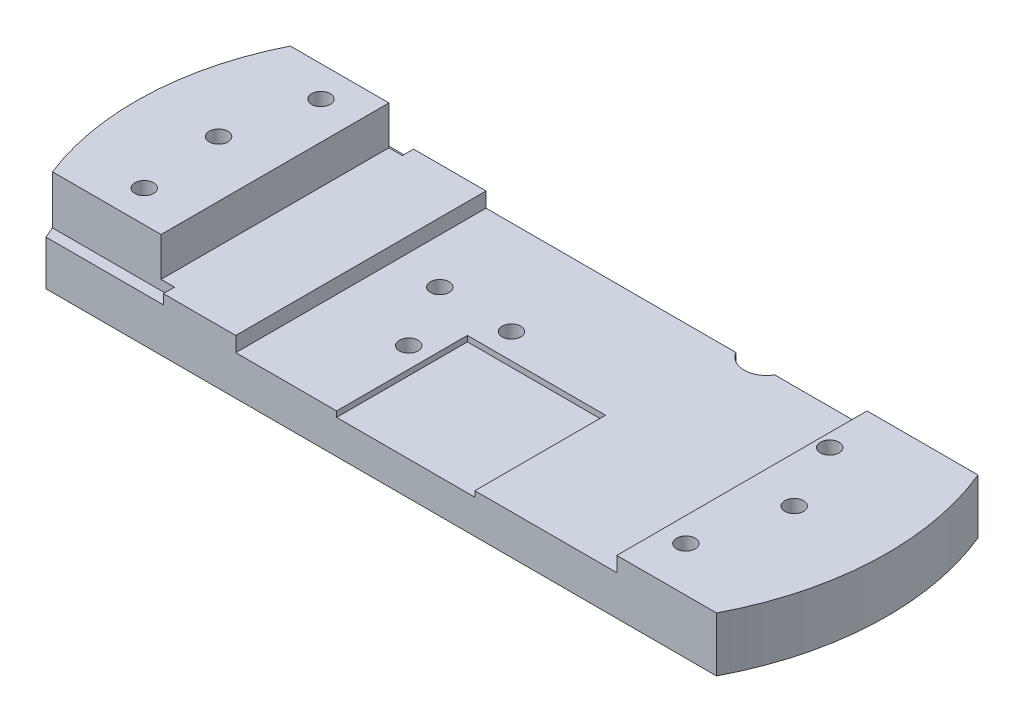
ISO-10303-21;
HEADER;
FILE_DESCRIPTION(('STEP AP214'),'2;1');
FILE_NAME('part.step','',(''),(''),'','','');
FILE_SCHEMA(('AUTOMOTIVE_DESIGN { 1 0 10303 214 1 1 1 1 }'));
ENDSEC;
DATA;
#1=APPLICATION_CONTEXT('core data for automotive mechanical design processes');
#2=APPLICATION_PROTOCOL_DEFINITION('international standard','automotive_design',2000,#1);
#3=PRODUCT_CONTEXT('',#1,'mechanical');
#4=PRODUCT('Part','Part','',(#3));
#5=PRODUCT_RELATED_PRODUCT_CATEGORY('part','',(#4));
#6=PRODUCT_DEFINITION_FORMATION('','',#4);
#7=PRODUCT_DEFINITION_CONTEXT('part definition',#1,'design');
#8=PRODUCT_DEFINITION('design','',#6,#7);
#9=PRODUCT_DEFINITION_SHAPE('','',#8);
#10=(LENGTH_UNIT() NAMED_UNIT(*) SI_UNIT(.MILLI.,.METRE.));
#11=(NAMED_UNIT(*) PLANE_ANGLE_UNIT() SI_UNIT($,.RADIAN.));
#12=(NAMED_UNIT(*) SI_UNIT($,.STERADIAN.) SOLID_ANGLE_UNIT());
#13=UNCERTAINTY_MEASURE_WITH_UNIT(LENGTH_MEASURE(1.E-05),#10,'distance_accuracy_value','');
#14=(GEOMETRIC_REPRESENTATION_CONTEXT(3) GLOBAL_UNCERTAINTY_ASSIGNED_CONTEXT((#13)) GLOBAL_UNIT_ASSIGNED_CONTEXT((#10,
#11,#12)) REPRESENTATION_CONTEXT('',''));
#15=CARTESIAN_POINT('',(0.,0.,0.));
#16=DIRECTION('',(0.,0.,1.));
#17=DIRECTION('',(1.,0.,0.));
#18=AXIS2_PLACEMENT_3D('',#15,#16,#17);
#19=CARTESIAN_POINT('',(0.,25.,0.));
#20=DIRECTION('',(0.,-1.,0.));
#21=DIRECTION('',(0.,0.,-1.));
#22=AXIS2_PLACEMENT_3D('',#19,#20,#21);
#23=PLANE('',#22);
#24=CARTESIAN_POINT('',(-76.2,25.,22.));
#25=DIRECTION('',(0.,-1.,0.));
#26=DIRECTION('',(0.,0.,-1.));
#27=AXIS2_PLACEMENT_3D('',#24,#25,#26);
#28=CIRCLE('',#27,2.50000000000001);
#29=CARTESIAN_POINT('',(-76.2,25.,19.5));
#30=VERTEX_POINT('',#29);
#31=EDGE_CURVE('E326',#30,#30,#28,.T.);
#32=ORIENTED_EDGE('',*,*,#31,.T.);
#33=EDGE_LOOP('',(#32));
#34=FACE_BOUND('',#33,.T.);
#35=CARTESIAN_POINT('',(-78.2,25.,0.100000000000003));
#36=DIRECTION('',(0.,-1.,0.));
#37=DIRECTION('',(0.,0.,-1.));
#38=AXIS2_PLACEMENT_3D('',#35,#36,#37);
#39=CIRCLE('',#38,2.49999999999999);
#40=CARTESIAN_POINT('',(-78.2,25.,-2.39999999999999));
#41=VERTEX_POINT('',#40);
#42=EDGE_CURVE('E334',#41,#41,#39,.T.);
#43=ORIENTED_EDGE('',*,*,#42,.T.);
#44=EDGE_LOOP('',(#43));
#45=FACE_BOUND('',#44,.T.);
#46=CARTESIAN_POINT('',(-73.2,25.,-22.3));
#47=DIRECTION('',(0.,-1.,0.));
#48=DIRECTION('',(0.,0.,-1.));
#49=AXIS2_PLACEMENT_3D('',#46,#47,#48);
#50=CIRCLE('',#49,2.50000000000001);
#51=CARTESIAN_POINT('',(-73.2,25.,-24.8));
#52=VERTEX_POINT('',#51);
#53=EDGE_CURVE('E297',#52,#52,#50,.T.);
#54=ORIENTED_EDGE('',*,*,#53,.T.);
#55=EDGE_LOOP('',(#54));
#56=FACE_BOUND('',#55,.T.);
#57=DIRECTION('',(-1.,0.,0.));
#58=VECTOR('',#57,1.);
#59=CARTESIAN_POINT('',(0.,25.,-30.5));
#60=LINE('',#59,#58);
#61=CARTESIAN_POINT('',(-63.2,25.,-30.5));
#62=VERTEX_POINT('',#61);
#63=CARTESIAN_POINT('',(-89.5873446539231,25.,-30.5));
#64=VERTEX_POINT('',#63);
#65=EDGE_CURVE('E349',#62,#64,#60,.T.);
#66=ORIENTED_EDGE('',*,*,#65,.T.);
#67=CARTESIAN_POINT('',(-22.6589151875398,25.,2.99288439458776));
#68=DIRECTION('',(0.,-1.,0.));
#69=DIRECTION('',(0.,0.,-1.));
#70=AXIS2_PLACEMENT_3D('',#67,#68,#69);
#71=CIRCLE('',#70,74.8410848124602);
#72=CARTESIAN_POINT('',(-92.2616921937509,25.,30.5));
#73=VERTEX_POINT('',#72);
#74=EDGE_CURVE('E483',#73,#64,#71,.T.);
#75=ORIENTED_EDGE('',*,*,#74,.F.);
#76=DIRECTION('',(-1.,0.,0.));
#77=VECTOR('',#76,1.);
#78=CARTESIAN_POINT('',(0.,25.,30.5));
#79=LINE('',#78,#77);
#80=CARTESIAN_POINT('',(-63.2,25.,30.5));
#81=VERTEX_POINT('',#80);
#82=EDGE_CURVE('E379',#81,#73,#79,.T.);
#83=ORIENTED_EDGE('',*,*,#82,.F.);
#84=DIRECTION('',(0.,0.,1.));
#85=VECTOR('',#84,1.);
#86=CARTESIAN_POINT('',(-63.2,25.,-33.5));
#87=LINE('',#86,#85);
#88=EDGE_CURVE('E462',#62,#81,#87,.T.);
#89=ORIENTED_EDGE('',*,*,#88,.F.);
#90=EDGE_LOOP('',(#66,#75,#83,#89));
#91=FACE_BOUND('',#90,.T.);
#92=ADVANCED_FACE('F87',(#34,#45,#56,#91),#23,.F.);
#93=CARTESIAN_POINT('',(-97.5,25.,-33.5));
#94=DIRECTION('',(0.,0.,1.));
#95=DIRECTION('',(1.,0.,0.));
#96=AXIS2_PLACEMENT_3D('',#93,#94,#95);
#97=PLANE('',#96);
#98=DIRECTION('',(1.,0.,0.));
#99=VECTOR('',#98,1.);
#100=CARTESIAN_POINT('',(0.,6.5,-33.5));
#101=LINE('',#100,#99);
#102=CARTESIAN_POINT('',(26.7038475772934,6.5,-33.5));
#103=VERTEX_POINT('',#102);
#104=CARTESIAN_POINT('',(37.0961524227066,6.5,-33.5));
#105=VERTEX_POINT('',#104);
#106=EDGE_CURVE('E238',#103,#105,#101,.T.);
#107=ORIENTED_EDGE('',*,*,#106,.T.);
#108=DIRECTION('',(0.,1.,0.));
#109=VECTOR('',#108,1.);
#110=CARTESIAN_POINT('',(37.0961524227066,6.5,-33.5));
#111=LINE('',#110,#109);
#112=CARTESIAN_POINT('',(37.0961524227066,10.6,-33.5));
#113=VERTEX_POINT('',#112);
#114=EDGE_CURVE('E246',#105,#113,#111,.T.);
#115=ORIENTED_EDGE('',*,*,#114,.T.);
#116=DIRECTION('',(1.,0.,0.));
#117=VECTOR('',#116,1.);
#118=CARTESIAN_POINT('',(0.,10.6,-33.5));
#119=LINE('',#118,#117);
#120=CARTESIAN_POINT('',(61.8,10.6,-33.5));
#121=VERTEX_POINT('',#120);
#122=EDGE_CURVE('E425',#113,#121,#119,.T.);
#123=ORIENTED_EDGE('',*,*,#122,.T.);
#124=DIRECTION('',(0.,1.,0.));
#125=VECTOR('',#124,1.);
#126=CARTESIAN_POINT('',(61.8,0.,-33.5));
#127=LINE('',#126,#125);
#128=CARTESIAN_POINT('',(61.8,14.5999999999999,-33.5));
#129=VERTEX_POINT('',#128);
#130=EDGE_CURVE('E410',#121,#129,#127,.T.);
#131=ORIENTED_EDGE('',*,*,#130,.T.);
#132=DIRECTION('',(1.,0.,0.));
#133=VECTOR('',#132,1.);
#134=CARTESIAN_POINT('',(0.,14.5999999999999,-33.5));
#135=LINE('',#134,#133);
#136=CARTESIAN_POINT('',(91.5,14.5999999999999,-33.5));
#137=VERTEX_POINT('',#136);
#138=EDGE_CURVE('E414',#129,#137,#135,.T.);
#139=ORIENTED_EDGE('',*,*,#138,.T.);
#140=DIRECTION('',(0.,-1.,0.));
#141=VECTOR('',#140,1.);
#142=CARTESIAN_POINT('',(91.5,25.,-33.5));
#143=LINE('',#142,#141);
#144=CARTESIAN_POINT('',(91.5,0.,-33.5));
#145=VERTEX_POINT('',#144);
#146=EDGE_CURVE('E468',#137,#145,#143,.T.);
#147=ORIENTED_EDGE('',*,*,#146,.T.);
#148=DIRECTION('',(-1.,0.,0.));
#149=VECTOR('',#148,1.);
#150=CARTESIAN_POINT('',(-97.5,0.,-33.5));
#151=LINE('',#150,#149);
#152=CARTESIAN_POINT('',(-88.,0.,-33.5));
#153=VERTEX_POINT('',#152);
#154=EDGE_CURVE('E482',#145,#153,#151,.T.);
#155=ORIENTED_EDGE('',*,*,#154,.T.);
#156=DIRECTION('',(0.,-1.,0.));
#157=VECTOR('',#156,1.);
#158=CARTESIAN_POINT('',(-88.,25.,-33.5));
#159=LINE('',#158,#157);
#160=CARTESIAN_POINT('',(-88.,12.,-33.5));
#161=VERTEX_POINT('',#160);
#162=EDGE_CURVE('E450',#161,#153,#159,.T.);
#163=ORIENTED_EDGE('',*,*,#162,.F.);
#164=DIRECTION('',(-1.,0.,0.));
#165=VECTOR('',#164,1.);
#166=CARTESIAN_POINT('',(0.,12.,-33.5));
#167=LINE('',#166,#165);
#168=CARTESIAN_POINT('',(-59.5873446539231,12.,-33.5));
#169=VERTEX_POINT('',#168);
#170=EDGE_CURVE('E352',#169,#161,#167,.T.);
#171=ORIENTED_EDGE('',*,*,#170,.F.);
#172=DIRECTION('',(0.,1.,0.));
#173=VECTOR('',#172,1.);
#174=CARTESIAN_POINT('',(-59.5873446539231,12.,-33.5));
#175=LINE('',#174,#173);
#176=CARTESIAN_POINT('',(-59.5873446539231,14.6,-33.5));
#177=VERTEX_POINT('',#176);
#178=EDGE_CURVE('E368',#169,#177,#175,.T.);
#179=ORIENTED_EDGE('',*,*,#178,.T.);
#180=DIRECTION('',(1.,0.,0.));
#181=VECTOR('',#180,1.);
#182=CARTESIAN_POINT('',(0.,14.5999999999999,-33.5));
#183=LINE('',#182,#181);
#184=CARTESIAN_POINT('',(-40.2,14.6,-33.5));
#185=VERTEX_POINT('',#184);
#186=EDGE_CURVE('E419',#177,#185,#183,.T.);
#187=ORIENTED_EDGE('',*,*,#186,.T.);
#188=DIRECTION('',(0.,-1.,0.));
#189=VECTOR('',#188,1.);
#190=CARTESIAN_POINT('',(-40.2000000000001,1.39471767468535E-13,-33.5));
#191=LINE('',#190,#189);
#192=CARTESIAN_POINT('',(-40.2,10.6,-33.5));
#193=VERTEX_POINT('',#192);
#194=EDGE_CURVE('E422',#185,#193,#191,.T.);
#195=ORIENTED_EDGE('',*,*,#194,.T.);
#196=CARTESIAN_POINT('',(26.7038475772934,10.6,-33.5));
#197=VERTEX_POINT('',#196);
#198=EDGE_CURVE('E252',#193,#197,#119,.T.);
#199=ORIENTED_EDGE('',*,*,#198,.T.);
#200=DIRECTION('',(0.,1.,0.));
#201=VECTOR('',#200,1.);
#202=CARTESIAN_POINT('',(26.7038475772934,6.5,-33.5));
#203=LINE('',#202,#201);
#204=EDGE_CURVE('E103',#103,#197,#203,.T.);
#205=ORIENTED_EDGE('',*,*,#204,.F.);
#206=EDGE_LOOP('',(#107,#115,#123,#131,#139,#147,#155,#163,#171,#179,#187,#195,#199,#205));
#207=FACE_BOUND('',#206,.T.);
#208=ADVANCED_FACE('F89',(#207),#97,.F.);
#209=CARTESIAN_POINT('',(-22.6589151875398,25.,2.99288439458776));
#210=DIRECTION('',(0.,-1.,0.));
#211=DIRECTION('',(0.,0.,-1.));
#212=AXIS2_PLACEMENT_3D('',#209,#210,#211);
#213=CYLINDRICAL_SURFACE('',#212,74.8410848124602);
#214=ORIENTED_EDGE('',*,*,#74,.T.);
#215=DIRECTION('',(0.,1.,0.));
#216=VECTOR('',#215,1.);
#217=CARTESIAN_POINT('',(-89.5873446539231,12.,-30.5));
#218=LINE('',#217,#216);
#219=CARTESIAN_POINT('',(-89.5873446539231,12.,-30.5));
#220=VERTEX_POINT('',#219);
#221=EDGE_CURVE('E364',#220,#64,#218,.T.);
#222=ORIENTED_EDGE('',*,*,#221,.F.);
#223=CARTESIAN_POINT('',(-22.6589151875398,12.,2.99288439458776));
#224=DIRECTION('',(0.,1.,0.));
#225=DIRECTION('',(0.,0.,1.));
#226=AXIS2_PLACEMENT_3D('',#223,#224,#225);
#227=CIRCLE('',#226,74.8410848124602);
#228=EDGE_CURVE('E355',#161,#220,#227,.T.);
#229=ORIENTED_EDGE('',*,*,#228,.F.);
#230=ORIENTED_EDGE('',*,*,#162,.T.);
#231=CARTESIAN_POINT('',(-22.6589151875398,0.,2.99288439458776));
#232=DIRECTION('',(0.,-1.,0.));
#233=DIRECTION('',(0.,0.,-1.));
#234=AXIS2_PLACEMENT_3D('',#231,#232,#233);
#235=CIRCLE('',#234,74.8410848124602);
#236=CARTESIAN_POINT('',(-91.,0.,33.5));
#237=VERTEX_POINT('',#236);
#238=EDGE_CURVE('E471',#237,#153,#235,.T.);
#239=ORIENTED_EDGE('',*,*,#238,.F.);
#240=DIRECTION('',(0.,-1.,0.));
#241=VECTOR('',#240,1.);
#242=CARTESIAN_POINT('',(-91.,25.,33.5));
#243=LINE('',#242,#241);
#244=CARTESIAN_POINT('',(-91.,12.,33.5));
#245=VERTEX_POINT('',#244);
#246=EDGE_CURVE('E479',#245,#237,#243,.T.);
#247=ORIENTED_EDGE('',*,*,#246,.F.);
#248=CARTESIAN_POINT('',(-22.6589151875398,12.,2.99288439458776));
#249=DIRECTION('',(0.,1.,0.));
#250=DIRECTION('',(0.,0.,1.));
#251=AXIS2_PLACEMENT_3D('',#248,#249,#250);
#252=CIRCLE('',#251,74.8410848124602);
#253=CARTESIAN_POINT('',(-92.2616921937509,12.,30.5));
#254=VERTEX_POINT('',#253);
#255=EDGE_CURVE('E387',#254,#245,#252,.T.);
#256=ORIENTED_EDGE('',*,*,#255,.F.);
#257=DIRECTION('',(0.,1.,0.));
#258=VECTOR('',#257,1.);
#259=CARTESIAN_POINT('',(-92.2616921937509,12.,30.5));
#260=LINE('',#259,#258);
#261=EDGE_CURVE('E363',#254,#73,#260,.T.);
#262=ORIENTED_EDGE('',*,*,#261,.T.);
#263=EDGE_LOOP('',(#214,#222,#229,#230,#239,#247,#256,#262));
#264=FACE_BOUND('',#263,.T.);
#265=ADVANCED_FACE('F564',(#264),#213,.T.);
#266=CARTESIAN_POINT('',(-63.2,0.,-33.5));
#267=DIRECTION('',(-1.,0.,0.));
#268=DIRECTION('',(0.,0.,1.));
#269=AXIS2_PLACEMENT_3D('',#266,#267,#268);
#270=PLANE('',#269);
#271=DIRECTION('',(0.,-1.,0.));
#272=VECTOR('',#271,1.);
#273=CARTESIAN_POINT('',(-63.2,0.,-30.5));
#274=LINE('',#273,#272);
#275=CARTESIAN_POINT('',(-63.2,14.6,-30.5));
#276=VERTEX_POINT('',#275);
#277=EDGE_CURVE('E406',#62,#276,#274,.T.);
#278=ORIENTED_EDGE('',*,*,#277,.F.);
#279=ORIENTED_EDGE('',*,*,#88,.T.);
#280=DIRECTION('',(0.,-1.,0.));
#281=VECTOR('',#280,1.);
#282=CARTESIAN_POINT('',(-63.2,0.,30.5));
#283=LINE('',#282,#281);
#284=CARTESIAN_POINT('',(-63.2,14.6,30.5));
#285=VERTEX_POINT('',#284);
#286=EDGE_CURVE('E367',#81,#285,#283,.T.);
#287=ORIENTED_EDGE('',*,*,#286,.T.);
#288=DIRECTION('',(0.,0.,1.));
#289=VECTOR('',#288,1.);
#290=CARTESIAN_POINT('',(-63.2,14.6,-33.5));
#291=LINE('',#290,#289);
#292=EDGE_CURVE('E458',#276,#285,#291,.T.);
#293=ORIENTED_EDGE('',*,*,#292,.F.);
#294=EDGE_LOOP('',(#278,#279,#287,#293));
#295=FACE_BOUND('',#294,.T.);
#296=ADVANCED_FACE('F684',(#295),#270,.F.);
#297=CARTESIAN_POINT('',(0.,14.5999999999999,-33.5));
#298=DIRECTION('',(0.,-1.,0.));
#299=DIRECTION('',(1.,0.,0.));
#300=AXIS2_PLACEMENT_3D('',#297,#298,#299);
#301=PLANE('',#300);
#302=DIRECTION('',(1.,0.,0.));
#303=VECTOR('',#302,1.);
#304=CARTESIAN_POINT('',(0.,14.5999999999999,-30.5));
#305=LINE('',#304,#303);
#306=CARTESIAN_POINT('',(-59.5873446539231,14.6,-30.5));
#307=VERTEX_POINT('',#306);
#308=EDGE_CURVE('E96',#276,#307,#305,.T.);
#309=ORIENTED_EDGE('',*,*,#308,.F.);
#310=ORIENTED_EDGE('',*,*,#292,.T.);
#311=DIRECTION('',(1.,0.,0.));
#312=VECTOR('',#311,1.);
#313=CARTESIAN_POINT('',(0.,14.5999999999999,30.5));
#314=LINE('',#313,#312);
#315=CARTESIAN_POINT('',(-59.5873446539231,14.6,30.5));
#316=VERTEX_POINT('',#315);
#317=EDGE_CURVE('E506',#285,#316,#314,.T.);
#318=ORIENTED_EDGE('',*,*,#317,.T.);
#319=DIRECTION('',(0.,0.,1.));
#320=VECTOR('',#319,1.);
#321=CARTESIAN_POINT('',(-59.5873446539233,14.6,-33.4999999999999));
#322=LINE('',#321,#320);
#323=CARTESIAN_POINT('',(-59.5873446539231,14.6,33.5));
#324=VERTEX_POINT('',#323);
#325=EDGE_CURVE('E502',#316,#324,#322,.T.);
#326=ORIENTED_EDGE('',*,*,#325,.T.);
#327=DIRECTION('',(1.,0.,0.));
#328=VECTOR('',#327,1.);
#329=CARTESIAN_POINT('',(0.,14.5999999999999,33.5));
#330=LINE('',#329,#328);
#331=CARTESIAN_POINT('',(-40.2,14.6,33.5));
#332=VERTEX_POINT('',#331);
#333=EDGE_CURVE('E435',#324,#332,#330,.T.);
#334=ORIENTED_EDGE('',*,*,#333,.T.);
#335=DIRECTION('',(0.,0.,1.));
#336=VECTOR('',#335,1.);
#337=CARTESIAN_POINT('',(-40.2,14.6,-33.5));
#338=LINE('',#337,#336);
#339=EDGE_CURVE('E454',#185,#332,#338,.T.);
#340=ORIENTED_EDGE('',*,*,#339,.F.);
#341=ORIENTED_EDGE('',*,*,#186,.F.);
#342=DIRECTION('',(0.,0.,-1.));
#343=VECTOR('',#342,1.);
#344=CARTESIAN_POINT('',(-59.5873446539231,14.6,-33.5));
#345=LINE('',#344,#343);
#346=EDGE_CURVE('E510',#307,#177,#345,.T.);
#347=ORIENTED_EDGE('',*,*,#346,.F.);
#348=EDGE_LOOP('',(#309,#310,#318,#326,#334,#340,#341,#347));
#349=FACE_BOUND('',#348,.T.);
#350=ADVANCED_FACE('F572',(#349),#301,.F.);
#351=CARTESIAN_POINT('',(0.,0.,0.));
#352=DIRECTION('',(0.,-1.,0.));
#353=DIRECTION('',(0.,0.,-1.));
#354=AXIS2_PLACEMENT_3D('',#351,#352,#353);
#355=PLANE('',#354);
#356=CARTESIAN_POINT('',(-8.20000000000003,0.,-8.3));
#357=DIRECTION('',(0.,-1.,0.));
#358=DIRECTION('',(0.,0.,-1.));
#359=AXIS2_PLACEMENT_3D('',#356,#357,#358);
#360=CIRCLE('',#359,2.5);
#361=CARTESIAN_POINT('',(-8.20000000000003,0.,-10.8));
#362=VERTEX_POINT('',#361);
#363=EDGE_CURVE('E317',#362,#362,#360,.T.);
#364=ORIENTED_EDGE('',*,*,#363,.F.);
#365=EDGE_LOOP('',(#364));
#366=FACE_BOUND('',#365,.T.);
#367=CARTESIAN_POINT('',(-18.7,0.,8.7));
#368=DIRECTION('',(0.,-1.,0.));
#369=DIRECTION('',(0.,0.,-1.));
#370=AXIS2_PLACEMENT_3D('',#367,#368,#369);
#371=CIRCLE('',#370,2.5);
#372=CARTESIAN_POINT('',(-18.7,0.,6.2));
#373=VERTEX_POINT('',#372);
#374=EDGE_CURVE('E322',#373,#373,#371,.T.);
#375=ORIENTED_EDGE('',*,*,#374,.F.);
#376=EDGE_LOOP('',(#375));
#377=FACE_BOUND('',#376,.T.);
#378=CARTESIAN_POINT('',(-76.2,0.,22.));
#379=DIRECTION('',(0.,-1.,0.));
#380=DIRECTION('',(0.,0.,-1.));
#381=AXIS2_PLACEMENT_3D('',#378,#379,#380);
#382=CIRCLE('',#381,2.50000000000001);
#383=CARTESIAN_POINT('',(-76.2,0.,19.5));
#384=VERTEX_POINT('',#383);
#385=EDGE_CURVE('E330',#384,#384,#382,.T.);
#386=ORIENTED_EDGE('',*,*,#385,.F.);
#387=EDGE_LOOP('',(#386));
#388=FACE_BOUND('',#387,.T.);
#389=CARTESIAN_POINT('',(-78.2,0.,0.100000000000003));
#390=DIRECTION('',(0.,-1.,0.));
#391=DIRECTION('',(0.,0.,-1.));
#392=AXIS2_PLACEMENT_3D('',#389,#390,#391);
#393=CIRCLE('',#392,2.49999999999999);
#394=CARTESIAN_POINT('',(-78.2,0.,-2.39999999999999));
#395=VERTEX_POINT('',#394);
#396=EDGE_CURVE('E301',#395,#395,#393,.T.);
#397=ORIENTED_EDGE('',*,*,#396,.F.);
#398=EDGE_LOOP('',(#397));
#399=FACE_BOUND('',#398,.T.);
#400=CARTESIAN_POINT('',(-73.2,0.,-22.3));
#401=DIRECTION('',(0.,-1.,0.));
#402=DIRECTION('',(0.,0.,-1.));
#403=AXIS2_PLACEMENT_3D('',#400,#401,#402);
#404=CIRCLE('',#403,2.50000000000001);
#405=CARTESIAN_POINT('',(-73.2,0.,-24.8));
#406=VERTEX_POINT('',#405);
#407=EDGE_CURVE('E302',#406,#406,#404,.T.);
#408=ORIENTED_EDGE('',*,*,#407,.F.);
#409=EDGE_LOOP('',(#408));
#410=FACE_BOUND('',#409,.T.);
#411=CARTESIAN_POINT('',(65.3,0.,-20.));
#412=DIRECTION('',(0.,-1.,0.));
#413=DIRECTION('',(0.,0.,-1.));
#414=AXIS2_PLACEMENT_3D('',#411,#412,#413);
#415=CIRCLE('',#414,2.50000000000001);
#416=CARTESIAN_POINT('',(65.3,0.,-22.5));
#417=VERTEX_POINT('',#416);
#418=EDGE_CURVE('E306',#417,#417,#415,.T.);
#419=ORIENTED_EDGE('',*,*,#418,.F.);
#420=EDGE_LOOP('',(#419));
#421=FACE_BOUND('',#420,.T.);
#422=CARTESIAN_POINT('',(74.1,0.,-1.7));
#423=DIRECTION('',(0.,-1.,0.));
#424=DIRECTION('',(0.,0.,-1.));
#425=AXIS2_PLACEMENT_3D('',#422,#423,#424);
#426=CIRCLE('',#425,2.5);
#427=CARTESIAN_POINT('',(74.1,0.,-4.2));
#428=VERTEX_POINT('',#427);
#429=EDGE_CURVE('E310',#428,#428,#426,.T.);
#430=ORIENTED_EDGE('',*,*,#429,.F.);
#431=EDGE_LOOP('',(#430));
#432=FACE_BOUND('',#431,.T.);
#433=CARTESIAN_POINT('',(68.3,0.,21.5));
#434=DIRECTION('',(0.,-1.,0.));
#435=DIRECTION('',(0.,0.,-1.));
#436=AXIS2_PLACEMENT_3D('',#433,#434,#435);
#437=CIRCLE('',#436,2.5);
#438=CARTESIAN_POINT('',(68.3,0.,19.));
#439=VERTEX_POINT('',#438);
#440=EDGE_CURVE('E288',#439,#439,#437,.T.);
#441=ORIENTED_EDGE('',*,*,#440,.F.);
#442=EDGE_LOOP('',(#441));
#443=FACE_BOUND('',#442,.T.);
#444=CARTESIAN_POINT('',(-28.1,0.,-9.));
#445=DIRECTION('',(0.,-1.,0.));
#446=DIRECTION('',(0.,0.,-1.));
#447=AXIS2_PLACEMENT_3D('',#444,#445,#446);
#448=CIRCLE('',#447,2.5);
#449=CARTESIAN_POINT('',(-28.1,0.,-11.5));
#450=VERTEX_POINT('',#449);
#451=EDGE_CURVE('E321',#450,#450,#448,.T.);
#452=ORIENTED_EDGE('',*,*,#451,.F.);
#453=EDGE_LOOP('',(#452));
#454=FACE_BOUND('',#453,.T.);
#455=ORIENTED_EDGE('',*,*,#154,.F.);
#456=CARTESIAN_POINT('',(18.092213290183,0.,-3.21975164372315));
#457=DIRECTION('',(0.,-1.,0.));
#458=DIRECTION('',(0.,0.,-1.));
#459=AXIS2_PLACEMENT_3D('',#456,#457,#458);
#460=CIRCLE('',#459,79.407786709817);
#461=CARTESIAN_POINT('',(88.5,0.,33.5));
#462=VERTEX_POINT('',#461);
#463=EDGE_CURVE('E474',#145,#462,#460,.T.);
#464=ORIENTED_EDGE('',*,*,#463,.T.);
#465=DIRECTION('',(1.,0.,0.));
#466=VECTOR('',#465,1.);
#467=CARTESIAN_POINT('',(-97.5,0.,33.5));
#468=LINE('',#467,#466);
#469=EDGE_CURVE('E495',#237,#462,#468,.T.);
#470=ORIENTED_EDGE('',*,*,#469,.F.);
#471=ORIENTED_EDGE('',*,*,#238,.T.);
#472=EDGE_LOOP('',(#455,#464,#470,#471));
#473=FACE_BOUND('',#472,.T.);
#474=ADVANCED_FACE('F569',(#366,#377,#388,#399,#410,#421,#432,#443,#454,#473),#355,.T.);
#475=CARTESIAN_POINT('',(-97.5,25.,33.5));
#476=DIRECTION('',(0.,0.,-1.));
#477=DIRECTION('',(-1.,0.,0.));
#478=AXIS2_PLACEMENT_3D('',#475,#476,#477);
#479=PLANE('',#478);
#480=DIRECTION('',(1.,0.,0.));
#481=VECTOR('',#480,1.);
#482=CARTESIAN_POINT('',(-13.2,9.09999999999997,33.5));
#483=LINE('',#482,#481);
#484=CARTESIAN_POINT('',(-13.2,9.09999999999997,33.5));
#485=VERTEX_POINT('',#484);
#486=CARTESIAN_POINT('',(23.8,9.09999999999997,33.5));
#487=VERTEX_POINT('',#486);
#488=EDGE_CURVE('E263',#485,#487,#483,.T.);
#489=ORIENTED_EDGE('',*,*,#488,.F.);
#490=DIRECTION('',(0.,1.,0.));
#491=VECTOR('',#490,1.);
#492=CARTESIAN_POINT('',(-13.2,9.09999999999997,33.5));
#493=LINE('',#492,#491);
#494=CARTESIAN_POINT('',(-13.2,10.6,33.5));
#495=VERTEX_POINT('',#494);
#496=EDGE_CURVE('E276',#485,#495,#493,.T.);
#497=ORIENTED_EDGE('',*,*,#496,.T.);
#498=DIRECTION('',(1.,0.,0.));
#499=VECTOR('',#498,1.);
#500=CARTESIAN_POINT('',(0.,10.6,33.5));
#501=LINE('',#500,#499);
#502=CARTESIAN_POINT('',(-40.2,10.6,33.5));
#503=VERTEX_POINT('',#502);
#504=EDGE_CURVE('E415',#503,#495,#501,.T.);
#505=ORIENTED_EDGE('',*,*,#504,.F.);
#506=DIRECTION('',(0.,-1.,0.));
#507=VECTOR('',#506,1.);
#508=CARTESIAN_POINT('',(-40.2000000000001,1.39471767468535E-13,33.5));
#509=LINE('',#508,#507);
#510=EDGE_CURVE('E438',#332,#503,#509,.T.);
#511=ORIENTED_EDGE('',*,*,#510,.F.);
#512=ORIENTED_EDGE('',*,*,#333,.F.);
#513=DIRECTION('',(0.,1.,0.));
#514=VECTOR('',#513,1.);
#515=CARTESIAN_POINT('',(-59.5873446539231,12.,33.5));
#516=LINE('',#515,#514);
#517=CARTESIAN_POINT('',(-59.5873446539231,12.,33.5));
#518=VERTEX_POINT('',#517);
#519=EDGE_CURVE('E390',#518,#324,#516,.T.);
#520=ORIENTED_EDGE('',*,*,#519,.F.);
#521=DIRECTION('',(1.,0.,0.));
#522=VECTOR('',#521,1.);
#523=CARTESIAN_POINT('',(0.,12.,33.5));
#524=LINE('',#523,#522);
#525=EDGE_CURVE('E374',#245,#518,#524,.T.);
#526=ORIENTED_EDGE('',*,*,#525,.F.);
#527=ORIENTED_EDGE('',*,*,#246,.T.);
#528=ORIENTED_EDGE('',*,*,#469,.T.);
#529=DIRECTION('',(0.,-1.,0.));
#530=VECTOR('',#529,1.);
#531=CARTESIAN_POINT('',(88.5,25.,33.5));
#532=LINE('',#531,#530);
#533=CARTESIAN_POINT('',(88.5,14.5999999999999,33.5));
#534=VERTEX_POINT('',#533);
#535=EDGE_CURVE('E478',#534,#462,#532,.T.);
#536=ORIENTED_EDGE('',*,*,#535,.F.);
#537=DIRECTION('',(1.,0.,0.));
#538=VECTOR('',#537,1.);
#539=CARTESIAN_POINT('',(0.,14.5999999999999,33.5));
#540=LINE('',#539,#538);
#541=CARTESIAN_POINT('',(61.8,14.5999999999999,33.5));
#542=VERTEX_POINT('',#541);
#543=EDGE_CURVE('E432',#542,#534,#540,.T.);
#544=ORIENTED_EDGE('',*,*,#543,.F.);
#545=DIRECTION('',(0.,1.,0.));
#546=VECTOR('',#545,1.);
#547=CARTESIAN_POINT('',(61.8,0.,33.5));
#548=LINE('',#547,#546);
#549=CARTESIAN_POINT('',(61.8,10.6,33.5));
#550=VERTEX_POINT('',#549);
#551=EDGE_CURVE('E409',#550,#542,#548,.T.);
#552=ORIENTED_EDGE('',*,*,#551,.F.);
#553=CARTESIAN_POINT('',(23.8,10.6,33.5));
#554=VERTEX_POINT('',#553);
#555=EDGE_CURVE('E442',#554,#550,#501,.T.);
#556=ORIENTED_EDGE('',*,*,#555,.F.);
#557=DIRECTION('',(0.,1.,0.));
#558=VECTOR('',#557,1.);
#559=CARTESIAN_POINT('',(23.8,9.09999999999997,33.5));
#560=LINE('',#559,#558);
#561=EDGE_CURVE('E110',#487,#554,#560,.T.);
#562=ORIENTED_EDGE('',*,*,#561,.F.);
#563=EDGE_LOOP('',(#489,#497,#505,#511,#512,#520,#526,#527,#528,#536,#544,#552,#556,#562));
#564=FACE_BOUND('',#563,.T.);
#565=ADVANCED_FACE('F571',(#564),#479,.F.);
#566=CARTESIAN_POINT('',(18.092213290183,25.,-3.21975164372315));
#567=DIRECTION('',(0.,-1.,0.));
#568=DIRECTION('',(0.,0.,-1.));
#569=AXIS2_PLACEMENT_3D('',#566,#567,#568);
#570=CYLINDRICAL_SURFACE('',#569,79.407786709817);
#571=ORIENTED_EDGE('',*,*,#146,.F.);
#572=CARTESIAN_POINT('',(18.092213290183,14.5999999999999,-3.21975164372315));
#573=DIRECTION('',(0.,-1.,0.));
#574=DIRECTION('',(1.,0.,0.));
#575=AXIS2_PLACEMENT_3D('',#572,#573,#574);
#576=CIRCLE('',#575,79.407786709817);
#577=EDGE_CURVE('E499',#534,#137,#576,.F.);
#578=ORIENTED_EDGE('',*,*,#577,.F.);
#579=ORIENTED_EDGE('',*,*,#535,.T.);
#580=ORIENTED_EDGE('',*,*,#463,.F.);
#581=EDGE_LOOP('',(#571,#578,#579,#580));
#582=FACE_BOUND('',#581,.T.);
#583=ADVANCED_FACE('F575',(#582),#570,.T.);
#584=CARTESIAN_POINT('',(-40.2000000000001,1.39471767468535E-13,-33.5));
#585=DIRECTION('',(-1.,0.,0.));
#586=DIRECTION('',(0.,-1.,0.));
#587=AXIS2_PLACEMENT_3D('',#584,#585,#586);
#588=PLANE('',#587);
#589=ORIENTED_EDGE('',*,*,#510,.T.);
#590=DIRECTION('',(0.,0.,1.));
#591=VECTOR('',#590,1.);
#592=CARTESIAN_POINT('',(-40.2,10.6,-33.5));
#593=LINE('',#592,#591);
#594=EDGE_CURVE('E451',#193,#503,#593,.T.);
#595=ORIENTED_EDGE('',*,*,#594,.F.);
#596=ORIENTED_EDGE('',*,*,#194,.F.);
#597=ORIENTED_EDGE('',*,*,#339,.T.);
#598=EDGE_LOOP('',(#589,#595,#596,#597));
#599=FACE_BOUND('',#598,.T.);
#600=ADVANCED_FACE('F580',(#599),#588,.F.);
#601=CARTESIAN_POINT('',(0.,10.6,-33.5));
#602=DIRECTION('',(0.,-1.,0.));
#603=DIRECTION('',(1.,0.,0.));
#604=AXIS2_PLACEMENT_3D('',#601,#602,#603);
#605=PLANE('',#604);
#606=CARTESIAN_POINT('',(-8.20000000000003,10.6,-8.3));
#607=DIRECTION('',(0.,-1.,0.));
#608=DIRECTION('',(1.,0.,0.));
#609=AXIS2_PLACEMENT_3D('',#606,#607,#608);
#610=CIRCLE('',#609,2.5);
#611=CARTESIAN_POINT('',(-5.70000000000003,10.6,-8.3));
#612=VERTEX_POINT('',#611);
#613=EDGE_CURVE('E393',#612,#612,#610,.T.);
#614=ORIENTED_EDGE('',*,*,#613,.T.);
#615=EDGE_LOOP('',(#614));
#616=FACE_BOUND('',#615,.T.);
#617=CARTESIAN_POINT('',(-18.7,10.6,8.7));
#618=DIRECTION('',(0.,-1.,0.));
#619=DIRECTION('',(1.,0.,0.));
#620=AXIS2_PLACEMENT_3D('',#617,#618,#619);
#621=CIRCLE('',#620,2.5);
#622=CARTESIAN_POINT('',(-16.2,10.6,8.7));
#623=VERTEX_POINT('',#622);
#624=EDGE_CURVE('E531',#623,#623,#621,.T.);
#625=ORIENTED_EDGE('',*,*,#624,.T.);
#626=EDGE_LOOP('',(#625));
#627=FACE_BOUND('',#626,.T.);
#628=CARTESIAN_POINT('',(-28.1,10.6,-9.));
#629=DIRECTION('',(0.,-1.,0.));
#630=DIRECTION('',(1.,0.,0.));
#631=AXIS2_PLACEMENT_3D('',#628,#629,#630);
#632=CIRCLE('',#631,2.5);
#633=CARTESIAN_POINT('',(-25.6,10.6,-9.));
#634=VERTEX_POINT('',#633);
#635=EDGE_CURVE('E527',#634,#634,#632,.T.);
#636=ORIENTED_EDGE('',*,*,#635,.T.);
#637=EDGE_LOOP('',(#636));
#638=FACE_BOUND('',#637,.T.);
#639=ORIENTED_EDGE('',*,*,#122,.F.);
#640=CARTESIAN_POINT('',(31.9,10.6,-36.5));
#641=DIRECTION('',(0.,-1.,0.));
#642=DIRECTION('',(1.,0.,0.));
#643=AXIS2_PLACEMENT_3D('',#640,#641,#642);
#644=CIRCLE('',#643,6.);
#645=EDGE_CURVE('E12',#113,#197,#644,.T.);
#646=ORIENTED_EDGE('',*,*,#645,.T.);
#647=ORIENTED_EDGE('',*,*,#198,.F.);
#648=ORIENTED_EDGE('',*,*,#594,.T.);
#649=ORIENTED_EDGE('',*,*,#504,.T.);
#650=DIRECTION('',(0.,0.,1.));
#651=VECTOR('',#650,1.);
#652=CARTESIAN_POINT('',(-13.2,10.6,-1.5));
#653=LINE('',#652,#651);
#654=CARTESIAN_POINT('',(-13.2,10.6,-1.5));
#655=VERTEX_POINT('',#654);
#656=EDGE_CURVE('E256',#655,#495,#653,.T.);
#657=ORIENTED_EDGE('',*,*,#656,.F.);
#658=DIRECTION('',(-1.,0.,0.));
#659=VECTOR('',#658,1.);
#660=CARTESIAN_POINT('',(-13.2,10.6,-1.5));
#661=LINE('',#660,#659);
#662=CARTESIAN_POINT('',(23.8,10.6,-1.5));
#663=VERTEX_POINT('',#662);
#664=EDGE_CURVE('E264',#663,#655,#661,.T.);
#665=ORIENTED_EDGE('',*,*,#664,.F.);
#666=DIRECTION('',(0.,0.,-1.));
#667=VECTOR('',#666,1.);
#668=CARTESIAN_POINT('',(23.8,10.6,-1.5));
#669=LINE('',#668,#667);
#670=EDGE_CURVE('E279',#554,#663,#669,.T.);
#671=ORIENTED_EDGE('',*,*,#670,.F.);
#672=ORIENTED_EDGE('',*,*,#555,.T.);
#673=DIRECTION('',(0.,0.,1.));
#674=VECTOR('',#673,1.);
#675=CARTESIAN_POINT('',(61.8,10.6,-33.5));
#676=LINE('',#675,#674);
#677=EDGE_CURVE('E446',#121,#550,#676,.T.);
#678=ORIENTED_EDGE('',*,*,#677,.F.);
#679=EDGE_LOOP('',(#639,#646,#647,#648,#649,#657,#665,#671,#672,#678));
#680=FACE_BOUND('',#679,.T.);
#681=ADVANCED_FACE('F538',(#616,#627,#638,#680),#605,.F.);
#682=CARTESIAN_POINT('',(61.8,0.,-33.5));
#683=DIRECTION('',(1.,0.,0.));
#684=DIRECTION('',(0.,0.,-1.));
#685=AXIS2_PLACEMENT_3D('',#682,#683,#684);
#686=PLANE('',#685);
#687=ORIENTED_EDGE('',*,*,#551,.T.);
#688=DIRECTION('',(0.,0.,1.));
#689=VECTOR('',#688,1.);
#690=CARTESIAN_POINT('',(61.8,14.5999999999999,-33.5));
#691=LINE('',#690,#689);
#692=EDGE_CURVE('E428',#129,#542,#691,.T.);
#693=ORIENTED_EDGE('',*,*,#692,.F.);
#694=ORIENTED_EDGE('',*,*,#130,.F.);
#695=ORIENTED_EDGE('',*,*,#677,.T.);
#696=EDGE_LOOP('',(#687,#693,#694,#695));
#697=FACE_BOUND('',#696,.T.);
#698=ADVANCED_FACE('F634',(#697),#686,.F.);
#699=CARTESIAN_POINT('',(0.,14.5999999999999,-33.5));
#700=DIRECTION('',(0.,-1.,0.));
#701=DIRECTION('',(1.,0.,0.));
#702=AXIS2_PLACEMENT_3D('',#699,#700,#701);
#703=PLANE('',#702);
#704=CARTESIAN_POINT('',(65.3,14.5999999999999,-20.));
#705=DIRECTION('',(0.,-1.,0.));
#706=DIRECTION('',(1.,0.,0.));
#707=AXIS2_PLACEMENT_3D('',#704,#705,#706);
#708=CIRCLE('',#707,2.50000000000001);
#709=CARTESIAN_POINT('',(67.8,14.5999999999999,-20.));
#710=VERTEX_POINT('',#709);
#711=EDGE_CURVE('E523',#710,#710,#708,.T.);
#712=ORIENTED_EDGE('',*,*,#711,.T.);
#713=EDGE_LOOP('',(#712));
#714=FACE_BOUND('',#713,.T.);
#715=CARTESIAN_POINT('',(74.1,14.5999999999999,-1.7));
#716=DIRECTION('',(0.,-1.,0.));
#717=DIRECTION('',(1.,0.,0.));
#718=AXIS2_PLACEMENT_3D('',#715,#716,#717);
#719=CIRCLE('',#718,2.5);
#720=CARTESIAN_POINT('',(76.6,14.5999999999999,-1.7));
#721=VERTEX_POINT('',#720);
#722=EDGE_CURVE('E519',#721,#721,#719,.T.);
#723=ORIENTED_EDGE('',*,*,#722,.T.);
#724=EDGE_LOOP('',(#723));
#725=FACE_BOUND('',#724,.T.);
#726=CARTESIAN_POINT('',(68.3,14.5999999999999,21.5));
#727=DIRECTION('',(0.,-1.,0.));
#728=DIRECTION('',(1.,0.,0.));
#729=AXIS2_PLACEMENT_3D('',#726,#727,#728);
#730=CIRCLE('',#729,2.5);
#731=CARTESIAN_POINT('',(70.8,14.5999999999999,21.5));
#732=VERTEX_POINT('',#731);
#733=EDGE_CURVE('E344',#732,#732,#730,.T.);
#734=ORIENTED_EDGE('',*,*,#733,.T.);
#735=EDGE_LOOP('',(#734));
#736=FACE_BOUND('',#735,.T.);
#737=ORIENTED_EDGE('',*,*,#577,.T.);
#738=ORIENTED_EDGE('',*,*,#138,.F.);
#739=ORIENTED_EDGE('',*,*,#692,.T.);
#740=ORIENTED_EDGE('',*,*,#543,.T.);
#741=EDGE_LOOP('',(#737,#738,#739,#740));
#742=FACE_BOUND('',#741,.T.);
#743=ADVANCED_FACE('F630',(#714,#725,#736,#742),#703,.F.);
#744=CARTESIAN_POINT('',(0.,12.,30.5));
#745=DIRECTION('',(0.,0.,-1.));
#746=DIRECTION('',(-1.,0.,0.));
#747=AXIS2_PLACEMENT_3D('',#744,#745,#746);
#748=PLANE('',#747);
#749=ORIENTED_EDGE('',*,*,#82,.T.);
#750=ORIENTED_EDGE('',*,*,#261,.F.);
#751=DIRECTION('',(-1.,0.,0.));
#752=VECTOR('',#751,1.);
#753=CARTESIAN_POINT('',(0.,12.,30.5));
#754=LINE('',#753,#752);
#755=CARTESIAN_POINT('',(-59.5873446539231,12.,30.5));
#756=VERTEX_POINT('',#755);
#757=EDGE_CURVE('E383',#756,#254,#754,.T.);
#758=ORIENTED_EDGE('',*,*,#757,.F.);
#759=DIRECTION('',(0.,1.,0.));
#760=VECTOR('',#759,1.);
#761=CARTESIAN_POINT('',(-59.5873446539231,12.,30.5));
#762=LINE('',#761,#760);
#763=EDGE_CURVE('E397',#756,#316,#762,.T.);
#764=ORIENTED_EDGE('',*,*,#763,.T.);
#765=ORIENTED_EDGE('',*,*,#317,.F.);
#766=ORIENTED_EDGE('',*,*,#286,.F.);
#767=EDGE_LOOP('',(#749,#750,#758,#764,#765,#766));
#768=FACE_BOUND('',#767,.T.);
#769=ADVANCED_FACE('F609',(#768),#748,.F.);
#770=CARTESIAN_POINT('',(-59.5873446539232,12.,1.37823420856376E-13));
#771=DIRECTION('',(1.,0.,0.));
#772=DIRECTION('',(0.,0.,-1.));
#773=AXIS2_PLACEMENT_3D('',#770,#771,#772);
#774=PLANE('',#773);
#775=ORIENTED_EDGE('',*,*,#763,.F.);
#776=DIRECTION('',(0.,0.,-1.));
#777=VECTOR('',#776,1.);
#778=CARTESIAN_POINT('',(-59.5873446539232,12.,1.37823420856376E-13));
#779=LINE('',#778,#777);
#780=EDGE_CURVE('E378',#518,#756,#779,.T.);
#781=ORIENTED_EDGE('',*,*,#780,.F.);
#782=ORIENTED_EDGE('',*,*,#519,.T.);
#783=ORIENTED_EDGE('',*,*,#325,.F.);
#784=EDGE_LOOP('',(#775,#781,#782,#783));
#785=FACE_BOUND('',#784,.T.);
#786=ADVANCED_FACE('F606',(#785),#774,.F.);
#787=CARTESIAN_POINT('',(0.,12.,0.));
#788=DIRECTION('',(0.,1.,0.));
#789=DIRECTION('',(0.,0.,1.));
#790=AXIS2_PLACEMENT_3D('',#787,#788,#789);
#791=PLANE('',#790);
#792=ORIENTED_EDGE('',*,*,#525,.T.);
#793=ORIENTED_EDGE('',*,*,#780,.T.);
#794=ORIENTED_EDGE('',*,*,#757,.T.);
#795=ORIENTED_EDGE('',*,*,#255,.T.);
#796=EDGE_LOOP('',(#792,#793,#794,#795));
#797=FACE_BOUND('',#796,.T.);
#798=ADVANCED_FACE('F612',(#797),#791,.T.);
#799=CARTESIAN_POINT('',(0.,12.,-30.5));
#800=DIRECTION('',(0.,0.,-1.));
#801=DIRECTION('',(-1.,0.,0.));
#802=AXIS2_PLACEMENT_3D('',#799,#800,#801);
#803=PLANE('',#802);
#804=ORIENTED_EDGE('',*,*,#277,.T.);
#805=ORIENTED_EDGE('',*,*,#308,.T.);
#806=DIRECTION('',(0.,1.,0.));
#807=VECTOR('',#806,1.);
#808=CARTESIAN_POINT('',(-59.5873446539231,12.,-30.5));
#809=LINE('',#808,#807);
#810=CARTESIAN_POINT('',(-59.5873446539231,12.,-30.5));
#811=VERTEX_POINT('',#810);
#812=EDGE_CURVE('E359',#811,#307,#809,.T.);
#813=ORIENTED_EDGE('',*,*,#812,.F.);
#814=DIRECTION('',(-1.,0.,0.));
#815=VECTOR('',#814,1.);
#816=CARTESIAN_POINT('',(0.,12.,-30.5));
#817=LINE('',#816,#815);
#818=EDGE_CURVE('E345',#811,#220,#817,.T.);
#819=ORIENTED_EDGE('',*,*,#818,.T.);
#820=ORIENTED_EDGE('',*,*,#221,.T.);
#821=ORIENTED_EDGE('',*,*,#65,.F.);
#822=EDGE_LOOP('',(#804,#805,#813,#819,#820,#821));
#823=FACE_BOUND('',#822,.T.);
#824=ADVANCED_FACE('F698',(#823),#803,.T.);
#825=CARTESIAN_POINT('',(-59.5873446539231,12.,0.));
#826=DIRECTION('',(-1.,0.,0.));
#827=DIRECTION('',(0.,0.,1.));
#828=AXIS2_PLACEMENT_3D('',#825,#826,#827);
#829=PLANE('',#828);
#830=ORIENTED_EDGE('',*,*,#346,.T.);
#831=ORIENTED_EDGE('',*,*,#178,.F.);
#832=DIRECTION('',(0.,0.,1.));
#833=VECTOR('',#832,1.);
#834=CARTESIAN_POINT('',(-59.5873446539231,12.,0.));
#835=LINE('',#834,#833);
#836=EDGE_CURVE('E348',#169,#811,#835,.T.);
#837=ORIENTED_EDGE('',*,*,#836,.T.);
#838=ORIENTED_EDGE('',*,*,#812,.T.);
#839=EDGE_LOOP('',(#830,#831,#837,#838));
#840=FACE_BOUND('',#839,.T.);
#841=ADVANCED_FACE('F666',(#840),#829,.T.);
#842=CARTESIAN_POINT('',(0.,12.,0.));
#843=DIRECTION('',(0.,1.,0.));
#844=DIRECTION('',(0.,0.,1.));
#845=AXIS2_PLACEMENT_3D('',#842,#843,#844);
#846=PLANE('',#845);
#847=ORIENTED_EDGE('',*,*,#818,.F.);
#848=ORIENTED_EDGE('',*,*,#836,.F.);
#849=ORIENTED_EDGE('',*,*,#170,.T.);
#850=ORIENTED_EDGE('',*,*,#228,.T.);
#851=EDGE_LOOP('',(#847,#848,#849,#850));
#852=FACE_BOUND('',#851,.T.);
#853=ADVANCED_FACE('F661',(#852),#846,.T.);
#854=CARTESIAN_POINT('',(68.3,25.,21.5));
#855=DIRECTION('',(0.,-1.,0.));
#856=DIRECTION('',(0.,0.,-1.));
#857=AXIS2_PLACEMENT_3D('',#854,#855,#856);
#858=CYLINDRICAL_SURFACE('',#857,2.5);
#859=ORIENTED_EDGE('',*,*,#440,.T.);
#860=EDGE_LOOP('',(#859));
#861=FACE_BOUND('',#860,.T.);
#862=ORIENTED_EDGE('',*,*,#733,.F.);
#863=EDGE_LOOP('',(#862));
#864=FACE_BOUND('',#863,.T.);
#865=ADVANCED_FACE('F658',(#861,#864),#858,.F.);
#866=CARTESIAN_POINT('',(74.1,25.,-1.7));
#867=DIRECTION('',(0.,-1.,0.));
#868=DIRECTION('',(0.,0.,-1.));
#869=AXIS2_PLACEMENT_3D('',#866,#867,#868);
#870=CYLINDRICAL_SURFACE('',#869,2.5);
#871=ORIENTED_EDGE('',*,*,#429,.T.);
#872=EDGE_LOOP('',(#871));
#873=FACE_BOUND('',#872,.T.);
#874=ORIENTED_EDGE('',*,*,#722,.F.);
#875=EDGE_LOOP('',(#874));
#876=FACE_BOUND('',#875,.T.);
#877=ADVANCED_FACE('F655',(#873,#876),#870,.F.);
#878=CARTESIAN_POINT('',(65.3,25.,-20.));
#879=DIRECTION('',(0.,-1.,0.));
#880=DIRECTION('',(0.,0.,-1.));
#881=AXIS2_PLACEMENT_3D('',#878,#879,#880);
#882=CYLINDRICAL_SURFACE('',#881,2.50000000000001);
#883=ORIENTED_EDGE('',*,*,#418,.T.);
#884=EDGE_LOOP('',(#883));
#885=FACE_BOUND('',#884,.T.);
#886=ORIENTED_EDGE('',*,*,#711,.F.);
#887=EDGE_LOOP('',(#886));
#888=FACE_BOUND('',#887,.T.);
#889=ADVANCED_FACE('F652',(#885,#888),#882,.F.);
#890=CARTESIAN_POINT('',(-28.1,25.,-9.));
#891=DIRECTION('',(0.,-1.,0.));
#892=DIRECTION('',(0.,0.,-1.));
#893=AXIS2_PLACEMENT_3D('',#890,#891,#892);
#894=CYLINDRICAL_SURFACE('',#893,2.5);
#895=ORIENTED_EDGE('',*,*,#451,.T.);
#896=EDGE_LOOP('',(#895));
#897=FACE_BOUND('',#896,.T.);
#898=ORIENTED_EDGE('',*,*,#635,.F.);
#899=EDGE_LOOP('',(#898));
#900=FACE_BOUND('',#899,.T.);
#901=ADVANCED_FACE('F554',(#897,#900),#894,.F.);
#902=CARTESIAN_POINT('',(-18.7,25.,8.7));
#903=DIRECTION('',(0.,-1.,0.));
#904=DIRECTION('',(0.,0.,-1.));
#905=AXIS2_PLACEMENT_3D('',#902,#903,#904);
#906=CYLINDRICAL_SURFACE('',#905,2.5);
#907=ORIENTED_EDGE('',*,*,#374,.T.);
#908=EDGE_LOOP('',(#907));
#909=FACE_BOUND('',#908,.T.);
#910=ORIENTED_EDGE('',*,*,#624,.F.);
#911=EDGE_LOOP('',(#910));
#912=FACE_BOUND('',#911,.T.);
#913=ADVANCED_FACE('F544',(#909,#912),#906,.F.);
#914=CARTESIAN_POINT('',(-8.20000000000003,25.,-8.3));
#915=DIRECTION('',(0.,-1.,0.));
#916=DIRECTION('',(0.,0.,-1.));
#917=AXIS2_PLACEMENT_3D('',#914,#915,#916);
#918=CYLINDRICAL_SURFACE('',#917,2.5);
#919=ORIENTED_EDGE('',*,*,#363,.T.);
#920=EDGE_LOOP('',(#919));
#921=FACE_BOUND('',#920,.T.);
#922=ORIENTED_EDGE('',*,*,#613,.F.);
#923=EDGE_LOOP('',(#922));
#924=FACE_BOUND('',#923,.T.);
#925=ADVANCED_FACE('F541',(#921,#924),#918,.F.);
#926=CARTESIAN_POINT('',(-73.2,25.,-22.3));
#927=DIRECTION('',(0.,-1.,0.));
#928=DIRECTION('',(0.,0.,-1.));
#929=AXIS2_PLACEMENT_3D('',#926,#927,#928);
#930=CYLINDRICAL_SURFACE('',#929,2.50000000000001);
#931=ORIENTED_EDGE('',*,*,#53,.F.);
#932=EDGE_LOOP('',(#931));
#933=FACE_BOUND('',#932,.T.);
#934=ORIENTED_EDGE('',*,*,#407,.T.);
#935=EDGE_LOOP('',(#934));
#936=FACE_BOUND('',#935,.T.);
#937=ADVANCED_FACE('F543',(#933,#936),#930,.F.);
#938=CARTESIAN_POINT('',(-78.2,25.,0.100000000000003));
#939=DIRECTION('',(0.,-1.,0.));
#940=DIRECTION('',(0.,0.,-1.));
#941=AXIS2_PLACEMENT_3D('',#938,#939,#940);
#942=CYLINDRICAL_SURFACE('',#941,2.49999999999999);
#943=ORIENTED_EDGE('',*,*,#42,.F.);
#944=EDGE_LOOP('',(#943));
#945=FACE_BOUND('',#944,.T.);
#946=ORIENTED_EDGE('',*,*,#396,.T.);
#947=EDGE_LOOP('',(#946));
#948=FACE_BOUND('',#947,.T.);
#949=ADVANCED_FACE('F551',(#945,#948),#942,.F.);
#950=CARTESIAN_POINT('',(-76.2,25.,22.));
#951=DIRECTION('',(0.,-1.,0.));
#952=DIRECTION('',(0.,0.,-1.));
#953=AXIS2_PLACEMENT_3D('',#950,#951,#952);
#954=CYLINDRICAL_SURFACE('',#953,2.50000000000001);
#955=ORIENTED_EDGE('',*,*,#31,.F.);
#956=EDGE_LOOP('',(#955));
#957=FACE_BOUND('',#956,.T.);
#958=ORIENTED_EDGE('',*,*,#385,.T.);
#959=EDGE_LOOP('',(#958));
#960=FACE_BOUND('',#959,.T.);
#961=ADVANCED_FACE('F647',(#957,#960),#954,.F.);
#962=CARTESIAN_POINT('',(-13.2,9.09999999999997,-1.5));
#963=DIRECTION('',(-1.,0.,0.));
#964=DIRECTION('',(0.,0.,1.));
#965=AXIS2_PLACEMENT_3D('',#962,#963,#964);
#966=PLANE('',#965);
#967=ORIENTED_EDGE('',*,*,#656,.T.);
#968=ORIENTED_EDGE('',*,*,#496,.F.);
#969=DIRECTION('',(0.,0.,1.));
#970=VECTOR('',#969,1.);
#971=CARTESIAN_POINT('',(-13.2,9.09999999999997,-1.5));
#972=LINE('',#971,#970);
#973=CARTESIAN_POINT('',(-13.2,9.09999999999997,-1.5));
#974=VERTEX_POINT('',#973);
#975=EDGE_CURVE('E259',#974,#485,#972,.T.);
#976=ORIENTED_EDGE('',*,*,#975,.F.);
#977=DIRECTION('',(0.,1.,0.));
#978=VECTOR('',#977,1.);
#979=CARTESIAN_POINT('',(-13.2,9.09999999999997,-1.5));
#980=LINE('',#979,#978);
#981=EDGE_CURVE('E285',#974,#655,#980,.T.);
#982=ORIENTED_EDGE('',*,*,#981,.T.);
#983=EDGE_LOOP('',(#967,#968,#976,#982));
#984=FACE_BOUND('',#983,.T.);
#985=ADVANCED_FACE('F590',(#984),#966,.F.);
#986=CARTESIAN_POINT('',(-13.2,9.09999999999997,-1.5));
#987=DIRECTION('',(0.,0.,-1.));
#988=DIRECTION('',(-1.,0.,0.));
#989=AXIS2_PLACEMENT_3D('',#986,#987,#988);
#990=PLANE('',#989);
#991=ORIENTED_EDGE('',*,*,#664,.T.);
#992=ORIENTED_EDGE('',*,*,#981,.F.);
#993=DIRECTION('',(-1.,0.,0.));
#994=VECTOR('',#993,1.);
#995=CARTESIAN_POINT('',(-13.2,9.09999999999997,-1.5));
#996=LINE('',#995,#994);
#997=CARTESIAN_POINT('',(23.8,9.09999999999997,-1.5));
#998=VERTEX_POINT('',#997);
#999=EDGE_CURVE('E272',#998,#974,#996,.T.);
#1000=ORIENTED_EDGE('',*,*,#999,.F.);
#1001=DIRECTION('',(0.,1.,0.));
#1002=VECTOR('',#1001,1.);
#1003=CARTESIAN_POINT('',(23.8,9.09999999999997,-1.5));
#1004=LINE('',#1003,#1002);
#1005=EDGE_CURVE('E289',#998,#663,#1004,.T.);
#1006=ORIENTED_EDGE('',*,*,#1005,.T.);
#1007=EDGE_LOOP('',(#991,#992,#1000,#1006));
#1008=FACE_BOUND('',#1007,.T.);
#1009=ADVANCED_FACE('F639',(#1008),#990,.F.);
#1010=CARTESIAN_POINT('',(23.8,9.09999999999997,-1.5));
#1011=DIRECTION('',(1.,0.,0.));
#1012=DIRECTION('',(0.,0.,-1.));
#1013=AXIS2_PLACEMENT_3D('',#1010,#1011,#1012);
#1014=PLANE('',#1013);
#1015=ORIENTED_EDGE('',*,*,#670,.T.);
#1016=ORIENTED_EDGE('',*,*,#1005,.F.);
#1017=DIRECTION('',(0.,0.,-1.));
#1018=VECTOR('',#1017,1.);
#1019=CARTESIAN_POINT('',(23.8,9.09999999999997,-1.5));
#1020=LINE('',#1019,#1018);
#1021=EDGE_CURVE('E268',#487,#998,#1020,.T.);
#1022=ORIENTED_EDGE('',*,*,#1021,.F.);
#1023=ORIENTED_EDGE('',*,*,#561,.T.);
#1024=EDGE_LOOP('',(#1015,#1016,#1022,#1023));
#1025=FACE_BOUND('',#1024,.T.);
#1026=ADVANCED_FACE('F637',(#1025),#1014,.F.);
#1027=CARTESIAN_POINT('',(0.,9.09999999999997,0.));
#1028=DIRECTION('',(0.,1.,0.));
#1029=DIRECTION('',(-1.,0.,0.));
#1030=AXIS2_PLACEMENT_3D('',#1027,#1028,#1029);
#1031=PLANE('',#1030);
#1032=ORIENTED_EDGE('',*,*,#975,.T.);
#1033=ORIENTED_EDGE('',*,*,#488,.T.);
#1034=ORIENTED_EDGE('',*,*,#1021,.T.);
#1035=ORIENTED_EDGE('',*,*,#999,.T.);
#1036=EDGE_LOOP('',(#1032,#1033,#1034,#1035));
#1037=FACE_BOUND('',#1036,.T.);
#1038=ADVANCED_FACE('F586',(#1037),#1031,.T.);
#1039=CARTESIAN_POINT('',(31.9,6.5,-36.5));
#1040=DIRECTION('',(0.,1.,0.));
#1041=DIRECTION('',(0.,0.,1.));
#1042=AXIS2_PLACEMENT_3D('',#1039,#1040,#1041);
#1043=CYLINDRICAL_SURFACE('',#1042,6.);
#1044=ORIENTED_EDGE('',*,*,#114,.F.);
#1045=CARTESIAN_POINT('',(31.9,6.5,-36.5));
#1046=DIRECTION('',(0.,1.,0.));
#1047=DIRECTION('',(0.,0.,1.));
#1048=AXIS2_PLACEMENT_3D('',#1045,#1046,#1047);
#1049=CIRCLE('',#1048,6.);
#1050=EDGE_CURVE('E240',#103,#105,#1049,.T.);
#1051=ORIENTED_EDGE('',*,*,#1050,.F.);
#1052=ORIENTED_EDGE('',*,*,#204,.T.);
#1053=ORIENTED_EDGE('',*,*,#645,.F.);
#1054=EDGE_LOOP('',(#1044,#1051,#1052,#1053));
#1055=FACE_BOUND('',#1054,.T.);
#1056=ADVANCED_FACE('F245',(#1055),#1043,.F.);
#1057=CARTESIAN_POINT('',(0.,6.5,0.));
#1058=DIRECTION('',(0.,1.,0.));
#1059=DIRECTION('',(0.,0.,1.));
#1060=AXIS2_PLACEMENT_3D('',#1057,#1058,#1059);
#1061=PLANE('',#1060);
#1062=ORIENTED_EDGE('',*,*,#106,.F.);
#1063=ORIENTED_EDGE('',*,*,#1050,.T.);
#1064=EDGE_LOOP('',(#1062,#1063));
#1065=FACE_BOUND('',#1064,.T.);
#1066=ADVANCED_FACE('F239',(#1065),#1061,.T.);
#1067=CLOSED_SHELL('',(#92,#208,#265,#296,#350,#474,#565,#583,#600,#681,#698,#743,#769,#786,
#798,#824,#841,#853,#865,#877,#889,#901,#913,#925,#937,#949,#961,#985,#1009,#1026,#1038,#1056,#1066));
#1068=MANIFOLD_SOLID_BREP('B2',#1067);
#1069=ADVANCED_BREP_SHAPE_REPRESENTATION('',(#18,#1068),#14);
#1070=SHAPE_DEFINITION_REPRESENTATION(#9,#1069);
ENDSEC;
END-ISO-10303-21;
